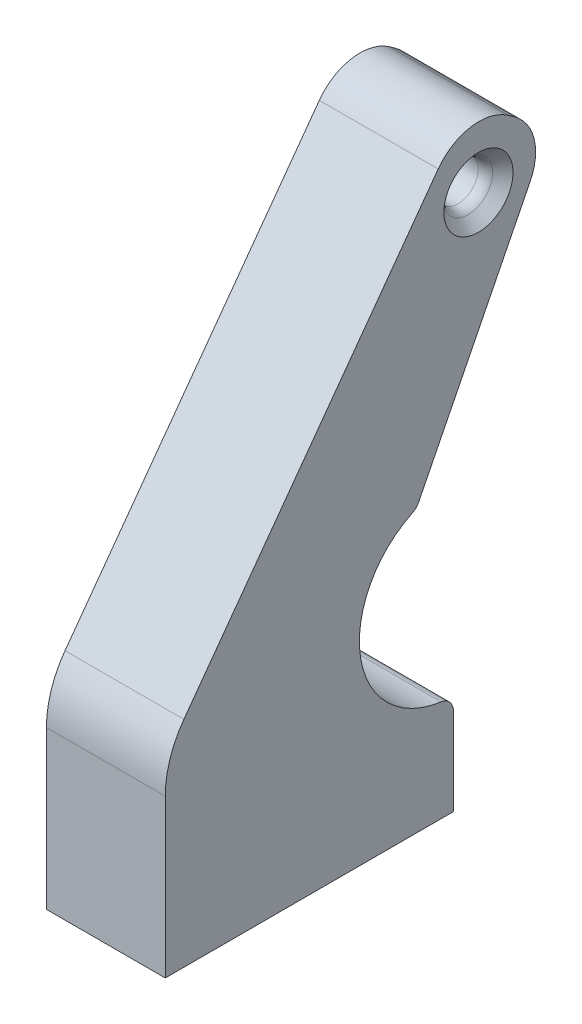
ISO-10303-21;
HEADER;
FILE_DESCRIPTION(('STEP AP214'),'2;1');
FILE_NAME('part.step','',(''),(''),'','','');
FILE_SCHEMA(('AUTOMOTIVE_DESIGN { 1 0 10303 214 1 1 1 1 }'));
ENDSEC;
DATA;
#1=APPLICATION_CONTEXT('core data for automotive mechanical design processes');
#2=APPLICATION_PROTOCOL_DEFINITION('international standard','automotive_design',2000,#1);
#3=PRODUCT_CONTEXT('',#1,'mechanical');
#4=PRODUCT('Part','Part','',(#3));
#5=PRODUCT_RELATED_PRODUCT_CATEGORY('part','',(#4));
#6=PRODUCT_DEFINITION_FORMATION('','',#4);
#7=PRODUCT_DEFINITION_CONTEXT('part definition',#1,'design');
#8=PRODUCT_DEFINITION('design','',#6,#7);
#9=PRODUCT_DEFINITION_SHAPE('','',#8);
#10=(LENGTH_UNIT() NAMED_UNIT(*) SI_UNIT(.MILLI.,.METRE.));
#11=(NAMED_UNIT(*) PLANE_ANGLE_UNIT() SI_UNIT($,.RADIAN.));
#12=(NAMED_UNIT(*) SI_UNIT($,.STERADIAN.) SOLID_ANGLE_UNIT());
#13=UNCERTAINTY_MEASURE_WITH_UNIT(LENGTH_MEASURE(1.E-05),#10,'distance_accuracy_value','');
#14=(GEOMETRIC_REPRESENTATION_CONTEXT(3) GLOBAL_UNCERTAINTY_ASSIGNED_CONTEXT((#13)) GLOBAL_UNIT_ASSIGNED_CONTEXT((#10,
#11,#12)) REPRESENTATION_CONTEXT('',''));
#15=CARTESIAN_POINT('',(0.,0.,0.));
#16=DIRECTION('',(0.,0.,1.));
#17=DIRECTION('',(1.,0.,0.));
#18=AXIS2_PLACEMENT_3D('',#15,#16,#17);
#19=CARTESIAN_POINT('',(-273.827793121338,-35.6710180798713,728.04998779297));
#20=DIRECTION('',(1.,0.,0.));
#21=DIRECTION('',(0.,0.30937778389199,0.950939213006847));
#22=AXIS2_PLACEMENT_3D('',#19,#20,#21);
#23=CYLINDRICAL_SURFACE('',#22,6.7499999999991);
#24=CARTESIAN_POINT('',(-270.75033569336,-35.6710180798713,728.04998779297));
#25=DIRECTION('',(-1.,0.,0.));
#26=DIRECTION('',(0.,0.30937778389199,0.950939213006847));
#27=AXIS2_PLACEMENT_3D('',#24,#25,#26);
#28=CIRCLE('',#27,6.7499999999991);
#29=CARTESIAN_POINT('',(-270.750335693359,-35.6710180798713,734.799987792969));
#30=VERTEX_POINT('',#29);
#31=CARTESIAN_POINT('',(-270.75033569336,-31.6993252843352,733.507840515229));
#32=VERTEX_POINT('',#31);
#33=EDGE_CURVE('E11',#30,#32,#28,.T.);
#34=ORIENTED_EDGE('',*,*,#33,.T.);
#35=DIRECTION('',(-1.,0.,0.));
#36=VECTOR('',#35,1.);
#37=CARTESIAN_POINT('',(-273.827793121338,-31.6993252843352,733.507840515229));
#38=LINE('',#37,#36);
#39=CARTESIAN_POINT('',(-279.00033569336,-31.6993252843351,733.507840515229));
#40=VERTEX_POINT('',#39);
#41=EDGE_CURVE('E31',#32,#40,#38,.T.);
#42=ORIENTED_EDGE('',*,*,#41,.T.);
#43=CARTESIAN_POINT('',(-279.00033569336,-35.6710180798713,728.04998779297));
#44=DIRECTION('',(1.,0.,0.));
#45=DIRECTION('',(0.,0.30937778389199,0.950939213006847));
#46=AXIS2_PLACEMENT_3D('',#43,#44,#45);
#47=CIRCLE('',#46,6.7499999999991);
#48=CARTESIAN_POINT('',(-279.00033569336,-35.6710180798713,734.799987792969));
#49=VERTEX_POINT('',#48);
#50=EDGE_CURVE('E364',#40,#49,#47,.T.);
#51=ORIENTED_EDGE('',*,*,#50,.T.);
#52=DIRECTION('',(1.,0.,0.));
#53=VECTOR('',#52,1.);
#54=CARTESIAN_POINT('',(-273.827793121338,-35.6710180798713,734.799987792969));
#55=LINE('',#54,#53);
#56=EDGE_CURVE('E361',#49,#30,#55,.T.);
#57=ORIENTED_EDGE('',*,*,#56,.T.);
#58=EDGE_LOOP('',(#34,#42,#51,#57));
#59=FACE_BOUND('',#58,.T.);
#60=ADVANCED_FACE('F16',(#59),#23,.T.);
#61=CARTESIAN_POINT('',(-274.37533569336,-46.6000583290239,734.799987792969));
#62=DIRECTION('',(0.,0.,-1.));
#63=DIRECTION('',(-1.,0.,0.));
#64=AXIS2_PLACEMENT_3D('',#61,#62,#63);
#65=PLANE('',#64);
#66=ORIENTED_EDGE('',*,*,#56,.F.);
#67=DIRECTION('',(0.,-1.,0.));
#68=VECTOR('',#67,1.);
#69=CARTESIAN_POINT('',(-279.00033569336,-40.6000632436393,734.799987792969));
#70=LINE('',#69,#68);
#71=CARTESIAN_POINT('',(-279.00033569336,-46.6000583290239,734.799987792969));
#72=VERTEX_POINT('',#71);
#73=EDGE_CURVE('E358',#49,#72,#70,.T.);
#74=ORIENTED_EDGE('',*,*,#73,.T.);
#75=DIRECTION('',(1.,0.,0.));
#76=VECTOR('',#75,1.);
#77=CARTESIAN_POINT('',(-275.56283569336,-46.6000583290239,734.799987792969));
#78=LINE('',#77,#76);
#79=CARTESIAN_POINT('',(-270.75033569336,-46.6000583290239,734.799987792969));
#80=VERTEX_POINT('',#79);
#81=EDGE_CURVE('E355',#72,#80,#78,.T.);
#82=ORIENTED_EDGE('',*,*,#81,.T.);
#83=DIRECTION('',(0.,1.,0.));
#84=VECTOR('',#83,1.);
#85=CARTESIAN_POINT('',(-270.750335693359,-40.6000632436393,734.799987792969));
#86=LINE('',#85,#84);
#87=EDGE_CURVE('E335',#80,#30,#86,.T.);
#88=ORIENTED_EDGE('',*,*,#87,.T.);
#89=EDGE_LOOP('',(#66,#74,#82,#88));
#90=FACE_BOUND('',#89,.T.);
#91=ADVANCED_FACE('F413',(#90),#65,.F.);
#92=CARTESIAN_POINT('',(-279.00033569336,-34.6000681582547,741.799997329712));
#93=DIRECTION('',(-1.,0.,0.));
#94=DIRECTION('',(0.,0.,1.));
#95=AXIS2_PLACEMENT_3D('',#92,#93,#94);
#96=PLANE('',#95);
#97=DIRECTION('',(0.,0.,1.));
#98=VECTOR('',#97,1.);
#99=CARTESIAN_POINT('',(-279.00033569336,-42.8500583290238,730.799997329712));
#100=LINE('',#99,#98);
#101=CARTESIAN_POINT('',(-279.00033569336,-42.8500583290238,716.799997329712));
#102=VERTEX_POINT('',#101);
#103=CARTESIAN_POINT('',(-279.00033569336,-42.8500583290238,722.799997329712));
#104=VERTEX_POINT('',#103);
#105=EDGE_CURVE('E203',#102,#104,#100,.T.);
#106=ORIENTED_EDGE('',*,*,#105,.F.);
#107=DIRECTION('',(0.,-1.,0.));
#108=VECTOR('',#107,1.);
#109=CARTESIAN_POINT('',(-279.00033569336,-40.1625632436392,716.799997329712));
#110=LINE('',#109,#108);
#111=CARTESIAN_POINT('',(-279.00033569336,-40.6000583290238,716.799997329712));
#112=VERTEX_POINT('',#111);
#113=EDGE_CURVE('E207',#112,#102,#110,.T.);
#114=ORIENTED_EDGE('',*,*,#113,.F.);
#115=DIRECTION('',(0.,0.,-1.));
#116=VECTOR('',#115,1.);
#117=CARTESIAN_POINT('',(-279.00033569336,-40.6000583290238,730.799997329712));
#118=LINE('',#117,#116);
#119=CARTESIAN_POINT('',(-279.00033569336,-40.6000583290238,722.799997329712));
#120=VERTEX_POINT('',#119);
#121=EDGE_CURVE('E188',#120,#112,#118,.T.);
#122=ORIENTED_EDGE('',*,*,#121,.F.);
#123=DIRECTION('',(0.,1.,0.));
#124=VECTOR('',#123,1.);
#125=CARTESIAN_POINT('',(-279.00033569336,-40.1625632436393,722.799997329712));
#126=LINE('',#125,#124);
#127=EDGE_CURVE('E187',#104,#120,#126,.T.);
#128=ORIENTED_EDGE('',*,*,#127,.F.);
#129=EDGE_LOOP('',(#106,#114,#122,#128));
#130=FACE_BOUND('',#129,.T.);
#131=DIRECTION('',(0.,0.,1.));
#132=VECTOR('',#131,1.);
#133=CARTESIAN_POINT('',(-279.00033569336,-42.8500583290238,735.799997329712));
#134=LINE('',#133,#132);
#135=CARTESIAN_POINT('',(-279.00033569336,-42.8500583290238,726.799997329712));
#136=VERTEX_POINT('',#135);
#137=CARTESIAN_POINT('',(-279.00033569336,-42.8500583290238,732.799997329712));
#138=VERTEX_POINT('',#137);
#139=EDGE_CURVE('E192',#136,#138,#134,.T.);
#140=ORIENTED_EDGE('',*,*,#139,.F.);
#141=DIRECTION('',(0.,-1.,0.));
#142=VECTOR('',#141,1.);
#143=CARTESIAN_POINT('',(-279.00033569336,-40.1625632436392,726.799997329712));
#144=LINE('',#143,#142);
#145=CARTESIAN_POINT('',(-279.00033569336,-40.6000583290238,726.799997329712));
#146=VERTEX_POINT('',#145);
#147=EDGE_CURVE('E196',#146,#136,#144,.T.);
#148=ORIENTED_EDGE('',*,*,#147,.F.);
#149=DIRECTION('',(0.,0.,-1.));
#150=VECTOR('',#149,1.);
#151=CARTESIAN_POINT('',(-279.00033569336,-40.6000583290238,730.799997329712));
#152=LINE('',#151,#150);
#153=CARTESIAN_POINT('',(-279.00033569336,-40.6000583290238,732.799997329712));
#154=VERTEX_POINT('',#153);
#155=EDGE_CURVE('E183',#154,#146,#152,.T.);
#156=ORIENTED_EDGE('',*,*,#155,.F.);
#157=DIRECTION('',(0.,1.,0.));
#158=VECTOR('',#157,1.);
#159=CARTESIAN_POINT('',(-279.00033569336,-40.1625632436393,732.799997329712));
#160=LINE('',#159,#158);
#161=EDGE_CURVE('E182',#138,#154,#160,.T.);
#162=ORIENTED_EDGE('',*,*,#161,.F.);
#163=EDGE_LOOP('',(#140,#148,#156,#162));
#164=FACE_BOUND('',#163,.T.);
#165=CARTESIAN_POINT('',(-279.00033569336,-10.248377883338,713.066791534424));
#166=DIRECTION('',(-1.,0.,0.));
#167=DIRECTION('',(0.,0.,1.));
#168=AXIS2_PLACEMENT_3D('',#165,#166,#167);
#169=CIRCLE('',#168,1.4);
#170=CARTESIAN_POINT('',(-279.00033569336,-10.248377883338,714.466791534424));
#171=VERTEX_POINT('',#170);
#172=EDGE_CURVE('E284',#171,#171,#169,.T.);
#173=ORIENTED_EDGE('',*,*,#172,.F.);
#174=EDGE_LOOP('',(#173));
#175=FACE_BOUND('',#174,.T.);
#176=ORIENTED_EDGE('',*,*,#50,.F.);
#177=DIRECTION('',(0.,-0.808570773668164,0.5883989326721));
#178=VECTOR('',#177,1.);
#179=CARTESIAN_POINT('',(-279.00033569336,-28.4007128286642,731.107432150961));
#180=LINE('',#179,#178);
#181=CARTESIAN_POINT('',(-279.00033569336,-7.44743679777908,715.859681856172));
#182=VERTEX_POINT('',#181);
#183=EDGE_CURVE('E267',#182,#40,#180,.T.);
#184=ORIENTED_EDGE('',*,*,#183,.F.);
#185=CARTESIAN_POINT('',(-279.00033569336,-9.50683306213146,713.029684148333));
#186=DIRECTION('',(-1.,0.,0.));
#187=DIRECTION('',(0.,0.986699796933502,0.16255310126659));
#188=AXIS2_PLACEMENT_3D('',#185,#186,#187);
#189=CIRCLE('',#188,3.49999999999997);
#190=CARTESIAN_POINT('',(-279.00033569336,-6.64845679766597,711.009861103921));
#191=VERTEX_POINT('',#190);
#192=EDGE_CURVE('E331',#182,#191,#189,.T.);
#193=ORIENTED_EDGE('',*,*,#192,.T.);
#194=DIRECTION('',(0.,0.577092298403606,0.816678932704428));
#195=VECTOR('',#194,1.);
#196=CARTESIAN_POINT('',(-279.00033569336,-4.34518633317845,714.26936130843));
#197=LINE('',#196,#195);
#198=CARTESIAN_POINT('',(-279.00033569336,-6.9534152925166,710.578295514183));
#199=VERTEX_POINT('',#198);
#200=EDGE_CURVE('E262',#199,#191,#197,.T.);
#201=ORIENTED_EDGE('',*,*,#200,.F.);
#202=CARTESIAN_POINT('',(-279.00033569336,-9.81179155698201,712.598118558596));
#203=DIRECTION('',(-1.,0.,0.));
#204=DIRECTION('',(0.,0.242526437814304,-0.970144796904619));
#205=AXIS2_PLACEMENT_3D('',#202,#203,#204);
#206=CIRCLE('',#205,3.49999999999997);
#207=CARTESIAN_POINT('',(-279.00033569336,-11.3834425296636,709.470833278985));
#208=VERTEX_POINT('',#207);
#209=EDGE_CURVE('E325',#199,#208,#206,.T.);
#210=ORIENTED_EDGE('',*,*,#209,.T.);
#211=DIRECTION('',(0.,0.89351007988874,-0.449043135051876));
#212=VECTOR('',#211,1.);
#213=CARTESIAN_POINT('',(-279.00033569336,-33.1299684273091,720.399784597342));
#214=LINE('',#213,#212);
#215=CARTESIAN_POINT('',(-279.00033569336,-26.7832547609087,717.210175138888));
#216=VERTEX_POINT('',#215);
#217=EDGE_CURVE('E256',#216,#208,#214,.T.);
#218=ORIENTED_EDGE('',*,*,#217,.F.);
#219=CARTESIAN_POINT('',(-279.00033569336,-26.3342116258567,718.103685218777));
#220=DIRECTION('',(1.,0.,0.));
#221=DIRECTION('',(0.,-0.711146802373736,-0.703043544507459));
#222=AXIS2_PLACEMENT_3D('',#219,#220,#221);
#223=CIRCLE('',#222,1.);
#224=CARTESIAN_POINT('',(-279.00033569336,-27.2328088672154,717.664910791739));
#225=VERTEX_POINT('',#224);
#226=EDGE_CURVE('E314',#225,#216,#223,.T.);
#227=ORIENTED_EDGE('',*,*,#226,.F.);
#228=CARTESIAN_POINT('',(-279.00033569336,-33.1000681582548,714.799997329712));
#229=DIRECTION('',(1.,0.,0.));
#230=DIRECTION('',(0.,0.,1.));
#231=AXIS2_PLACEMENT_3D('',#228,#229,#230);
#232=CIRCLE('',#231,6.52935377607868);
#233=CARTESIAN_POINT('',(-279.00033569336,-39.5715777867919,715.667190422941));
#234=VERTEX_POINT('',#233);
#235=EDGE_CURVE('E321',#225,#234,#232,.T.);
#236=ORIENTED_EDGE('',*,*,#235,.T.);
#237=CARTESIAN_POINT('',(-279.00033569336,-40.5627186945256,715.800004959107));
#238=DIRECTION('',(1.,0.,0.));
#239=DIRECTION('',(0.,0.658477586495885,-0.752600337551449));
#240=AXIS2_PLACEMENT_3D('',#237,#238,#239);
#241=CIRCLE('',#240,1.);
#242=CARTESIAN_POINT('',(-279.00033569336,-40.5627186945256,714.800004959107));
#243=VERTEX_POINT('',#242);
#244=EDGE_CURVE('E281',#243,#234,#241,.T.);
#245=ORIENTED_EDGE('',*,*,#244,.F.);
#246=DIRECTION('',(0.,-1.,0.));
#247=VECTOR('',#246,1.);
#248=CARTESIAN_POINT('',(-279.00033569336,-34.6000681582546,714.800004959107));
#249=LINE('',#248,#247);
#250=CARTESIAN_POINT('',(-279.00033569336,-46.6000583290238,714.800004959107));
#251=VERTEX_POINT('',#250);
#252=EDGE_CURVE('E318',#243,#251,#249,.T.);
#253=ORIENTED_EDGE('',*,*,#252,.T.);
#254=DIRECTION('',(0.,0.,1.));
#255=VECTOR('',#254,1.);
#256=CARTESIAN_POINT('',(-279.00033569336,-46.6000583290239,741.799997329712));
#257=LINE('',#256,#255);
#258=EDGE_CURVE('E315',#251,#72,#257,.T.);
#259=ORIENTED_EDGE('',*,*,#258,.T.);
#260=ORIENTED_EDGE('',*,*,#73,.F.);
#261=EDGE_LOOP('',(#176,#184,#193,#201,#210,#218,#227,#236,#245,#253,#259,#260));
#262=FACE_BOUND('',#261,.T.);
#263=ADVANCED_FACE('F375',(#130,#164,#175,#262),#96,.T.);
#264=CARTESIAN_POINT('',(-274.499992370605,-26.3342116258567,718.103685218777));
#265=DIRECTION('',(-1.,0.,0.));
#266=DIRECTION('',(0.,-0.711146802373736,-0.703043544507459));
#267=AXIS2_PLACEMENT_3D('',#264,#265,#266);
#268=CYLINDRICAL_SURFACE('',#267,1.);
#269=ORIENTED_EDGE('',*,*,#226,.T.);
#270=DIRECTION('',(1.,0.,0.));
#271=VECTOR('',#270,1.);
#272=CARTESIAN_POINT('',(-274.499992370605,-26.7832547609087,717.210175138888));
#273=LINE('',#272,#271);
#274=CARTESIAN_POINT('',(-270.750335693359,-26.7832547609087,717.210175138888));
#275=VERTEX_POINT('',#274);
#276=EDGE_CURVE('E311',#216,#275,#273,.T.);
#277=ORIENTED_EDGE('',*,*,#276,.T.);
#278=CARTESIAN_POINT('',(-270.75033569336,-26.3342116258568,718.103685218777));
#279=DIRECTION('',(-1.,0.,0.));
#280=DIRECTION('',(0.,-0.711146802373736,-0.703043544507459));
#281=AXIS2_PLACEMENT_3D('',#278,#279,#280);
#282=CIRCLE('',#281,1.);
#283=CARTESIAN_POINT('',(-270.75033569336,-27.2328088672154,717.664910791739));
#284=VERTEX_POINT('',#283);
#285=EDGE_CURVE('E308',#275,#284,#282,.T.);
#286=ORIENTED_EDGE('',*,*,#285,.T.);
#287=DIRECTION('',(-1.,0.,0.));
#288=VECTOR('',#287,1.);
#289=CARTESIAN_POINT('',(-274.499992370605,-27.2328088672154,717.664910791739));
#290=LINE('',#289,#288);
#291=EDGE_CURVE('E300',#284,#225,#290,.T.);
#292=ORIENTED_EDGE('',*,*,#291,.T.);
#293=EDGE_LOOP('',(#269,#277,#286,#292));
#294=FACE_BOUND('',#293,.T.);
#295=ADVANCED_FACE('F393',(#294),#268,.T.);
#296=CARTESIAN_POINT('',(-274.499992370605,-33.1000681582548,714.799997329712));
#297=DIRECTION('',(-1.,0.,0.));
#298=DIRECTION('',(0.,0.,1.));
#299=AXIS2_PLACEMENT_3D('',#296,#297,#298);
#300=CYLINDRICAL_SURFACE('',#299,6.52935377607868);
#301=ORIENTED_EDGE('',*,*,#291,.F.);
#302=CARTESIAN_POINT('',(-270.75033569336,-33.1000681582548,714.799997329712));
#303=DIRECTION('',(-1.,0.,0.));
#304=DIRECTION('',(0.,0.,1.));
#305=AXIS2_PLACEMENT_3D('',#302,#303,#304);
#306=CIRCLE('',#305,6.52935377607868);
#307=CARTESIAN_POINT('',(-270.75033569336,-39.5715777867919,715.667190422941));
#308=VERTEX_POINT('',#307);
#309=EDGE_CURVE('E293',#308,#284,#306,.T.);
#310=ORIENTED_EDGE('',*,*,#309,.F.);
#311=DIRECTION('',(1.,0.,0.));
#312=VECTOR('',#311,1.);
#313=CARTESIAN_POINT('',(-274.499992370605,-39.5715777867919,715.667190422941));
#314=LINE('',#313,#312);
#315=EDGE_CURVE('E171',#234,#308,#314,.T.);
#316=ORIENTED_EDGE('',*,*,#315,.F.);
#317=ORIENTED_EDGE('',*,*,#235,.F.);
#318=EDGE_LOOP('',(#301,#310,#316,#317));
#319=FACE_BOUND('',#318,.T.);
#320=CARTESIAN_POINT('',(-274.916685922484,-33.6000583290237,721.310179398005));
#321=CARTESIAN_POINT('',(-274.898596438544,-33.7294754310834,721.300223867614));
#322=CARTESIAN_POINT('',(-274.874562019229,-33.8574737290883,721.28652789275));
#323=CARTESIAN_POINT('',(-274.818432622359,-34.1104355228666,721.251968288405));
#324=CARTESIAN_POINT('',(-274.786356255468,-34.235405304876,721.231121167638));
#325=CARTESIAN_POINT('',(-274.717658497379,-34.4834142155065,721.182385045218));
#326=CARTESIAN_POINT('',(-274.681012111517,-34.6064381744713,721.154456370184));
#327=CARTESIAN_POINT('',(-274.605961872444,-34.8502498922692,721.091672624799));
#328=CARTESIAN_POINT('',(-274.567556867342,-34.9710361104918,721.056812963234));
#329=CARTESIAN_POINT('',(-274.483791171802,-35.2332447174275,720.972873607317));
#330=CARTESIAN_POINT('',(-274.43849508939,-35.3742283648451,720.922350570176));
#331=CARTESIAN_POINT('',(-274.351116998985,-35.6532662773653,720.811334975725));
#332=CARTESIAN_POINT('',(-274.309035169777,-35.7913203792103,720.750841864441));
#333=CARTESIAN_POINT('',(-274.230754719766,-36.0637788304842,720.619931780602));
#334=CARTESIAN_POINT('',(-274.194536346288,-36.1981941073777,720.549549684936));
#335=CARTESIAN_POINT('',(-274.130475656845,-36.4632138516919,720.398652397549));
#336=CARTESIAN_POINT('',(-274.102627651204,-36.5938208529732,720.31814414203));
#337=CARTESIAN_POINT('',(-274.056249721641,-36.8622905760693,720.139146184345));
#338=CARTESIAN_POINT('',(-274.038820684541,-36.9997061397411,720.039681900149));
#339=CARTESIAN_POINT('',(-274.022378450128,-37.2671526054903,719.829579150938));
#340=CARTESIAN_POINT('',(-274.023361949907,-37.3971848278211,719.718942693569));
#341=CARTESIAN_POINT('',(-274.047475668867,-37.6262346670539,719.508112688586));
#342=CARTESIAN_POINT('',(-274.066906747595,-37.7268198705014,719.409229271173));
#343=CARTESIAN_POINT('',(-274.126558694515,-37.918446161767,719.208490601389));
#344=CARTESIAN_POINT('',(-274.16674117819,-38.0095044990289,719.106641162452));
#345=CARTESIAN_POINT('',(-274.258674833654,-38.1588001736963,718.929373585275));
#346=CARTESIAN_POINT('',(-274.305291829229,-38.2196542056572,718.853510029549));
#347=CARTESIAN_POINT('',(-274.413407744287,-38.3329765228474,718.706114168694));
#348=CARTESIAN_POINT('',(-274.47490247873,-38.3854471594075,718.634580652608));
#349=CARTESIAN_POINT('',(-274.613299632079,-38.4811184718606,718.499146770859));
#350=CARTESIAN_POINT('',(-274.690323748403,-38.5242399651235,718.435313494752));
#351=CARTESIAN_POINT('',(-274.857971877942,-38.5996086245201,718.320263116173));
#352=CARTESIAN_POINT('',(-274.948585789793,-38.6318638103077,718.269036717013));
#353=CARTESIAN_POINT('',(-275.127313053853,-38.6812790726452,718.188870957083));
#354=CARTESIAN_POINT('',(-275.214095170936,-38.6998941525757,718.157849813044));
#355=CARTESIAN_POINT('',(-275.392838494733,-38.7283597608766,718.109919451293));
#356=CARTESIAN_POINT('',(-275.484796944939,-38.7382149080161,718.093002797129));
#357=CARTESIAN_POINT('',(-275.662848831733,-38.7486345733358,718.075092860627));
#358=CARTESIAN_POINT('',(-275.748779969568,-38.7499147934875,718.072873108537));
#359=CARTESIAN_POINT('',(-275.91979695346,-38.7450775423048,718.081209623027));
#360=CARTESIAN_POINT('',(-276.00488299974,-38.7389618675482,718.091762786867));
#361=CARTESIAN_POINT('',(-276.170171654379,-38.7195523062499,718.124784703877));
#362=CARTESIAN_POINT('',(-276.250435742047,-38.7063944120117,718.14702757483));
#363=CARTESIAN_POINT('',(-276.405648693829,-38.6730883521933,718.202193407293));
#364=CARTESIAN_POINT('',(-276.48059742908,-38.6529400172086,718.235116627626));
#365=CARTESIAN_POINT('',(-276.62543398966,-38.6051950000859,718.311136638133));
#366=CARTESIAN_POINT('',(-276.695122336699,-38.577406235112,718.354491587271));
#367=CARTESIAN_POINT('',(-276.825712966423,-38.515026068588,718.448816967474));
#368=CARTESIAN_POINT('',(-276.886613204242,-38.4804330882067,718.499789165365));
#369=CARTESIAN_POINT('',(-277.00352170562,-38.4018573282634,718.611627003385));
#370=CARTESIAN_POINT('',(-277.058717098276,-38.3573366310419,718.672961397927));
#371=CARTESIAN_POINT('',(-277.157830957669,-38.2617543775988,718.799467832837));
#372=CARTESIAN_POINT('',(-277.201743548333,-38.2106894338045,718.864641851244));
#373=CARTESIAN_POINT('',(-277.296088806238,-38.0785894959144,719.026339482918));
#374=CARTESIAN_POINT('',(-277.340566390633,-37.9944070888198,719.123775308087));
#375=CARTESIAN_POINT('',(-277.409569305362,-37.816571222677,719.317121989136));
#376=CARTESIAN_POINT('',(-277.434050556925,-37.722897348968,719.413029021545));
#377=CARTESIAN_POINT('',(-277.461752251025,-37.5560164190855,719.573502875767));
#378=CARTESIAN_POINT('',(-277.469034161687,-37.4845430739517,719.639241248555));
#379=CARTESIAN_POINT('',(-277.476232381096,-37.3385104791356,719.767645949927));
#380=CARTESIAN_POINT('',(-277.476145479757,-37.2639498986937,719.830310927751));
#381=CARTESIAN_POINT('',(-277.466478658022,-37.0363201891255,720.013075317427));
#382=CARTESIAN_POINT('',(-277.447485843722,-36.8793544753249,720.12789478387));
#383=CARTESIAN_POINT('',(-277.397529432425,-36.5913504505306,720.319688800997));
#384=CARTESIAN_POINT('',(-277.369824943249,-36.4616069885109,720.399593023204));
#385=CARTESIAN_POINT('',(-277.306162181129,-36.1983480501877,720.549436175968));
#386=CARTESIAN_POINT('',(-277.270199132614,-36.064830430776,720.619369302592));
#387=CARTESIAN_POINT('',(-277.192539163956,-35.7943692389465,720.749433499948));
#388=CARTESIAN_POINT('',(-277.15082904551,-35.6574183919806,720.809541291049));
#389=CARTESIAN_POINT('',(-277.064211077747,-35.3806246413393,720.91994229139));
#390=CARTESIAN_POINT('',(-277.019303308725,-35.2407818103457,720.970235746954));
#391=CARTESIAN_POINT('',(-276.935691019803,-34.979118012193,721.054404958988));
#392=CARTESIAN_POINT('',(-276.897054325944,-34.8577003338194,721.089609386296));
#393=CARTESIAN_POINT('',(-276.821516483059,-34.612605567646,721.153005010393));
#394=CARTESIAN_POINT('',(-276.784614196985,-34.4889300360431,721.181200855398));
#395=CARTESIAN_POINT('',(-276.715381526856,-34.2394839445746,721.230415688855));
#396=CARTESIAN_POINT('',(-276.683030026097,-34.113726307301,721.251468512288));
#397=CARTESIAN_POINT('',(-276.626429884366,-33.8591493447336,721.286348143858));
#398=CARTESIAN_POINT('',(-276.602200147378,-33.7303236138634,721.300158135359));
#399=CARTESIAN_POINT('',(-276.583989278932,-33.6000583290238,721.310179398005));
#400=B_SPLINE_CURVE_WITH_KNOTS('',3,(#320,#321,#322,#323,#324,#325,#326,#327,#328,#329,#330,
#331,#332,#333,#334,#335,#336,#337,#338,#339,#340,#341,#342,#343,#344,#345,#346,#347,#348,#349,
#350,#351,#352,#353,#354,#355,#356,#357,#358,#359,#360,#361,#362,#363,#364,#365,#366,#367,#368,
#369,#370,#371,#372,#373,#374,#375,#376,#377,#378,#379,#380,#381,#382,#383,#384,#385,#386,#387,
#388,#389,#390,#391,#392,#393,#394,#395,#396,#397,#398,#399),.UNSPECIFIED.,.F.,.F.,(4,2,2,2,2,2,
2,2,2,2,2,2,2,2,2,2,2,2,2,2,2,2,2,2,2,2,2,2,2,2,2,2,2,2,2,2,2,2,2,4),(0.,0.392550406198176,
0.784200625308011,1.17809545343948,1.57225207935849,2.04128646751293,2.51034692569801,
2.97779277459349,3.44492015938974,3.95527909259931,4.46554647661927,4.89120747938449,
5.31608392900281,5.63839654192885,5.96061859500416,6.28547144253412,6.61008401119135,
6.89061798127265,7.17100394889987,7.42766008178672,7.68425388142843,7.93606250173195,
8.18787722472558,8.44671589084939,8.70561468818124,8.9857820651996,9.26609505870124,
9.67252186527204,10.0798421761935,10.3715964831279,10.6634778880245,11.2474529318844,
11.7115085003218,12.175833091009,12.6412423627619,13.1066399519583,13.5030114762187,
13.8991194141191,14.2933239861291,14.6884398274054),.UNSPECIFIED.);
#401=CARTESIAN_POINT('',(-274.916685922484,-33.6000583290238,721.310179398005));
#402=VERTEX_POINT('',#401);
#403=CARTESIAN_POINT('',(-276.583989278932,-33.6000583290238,721.310179398005));
#404=VERTEX_POINT('',#403);
#405=EDGE_CURVE('E20',#402,#404,#400,.T.);
#406=ORIENTED_EDGE('',*,*,#405,.F.);
#407=DIRECTION('',(1.,0.,0.));
#408=VECTOR('',#407,1.);
#409=CARTESIAN_POINT('',(-274.499992370605,-33.6000583290238,721.310179398005));
#410=LINE('',#409,#408);
#411=EDGE_CURVE('E168',#404,#402,#410,.T.);
#412=ORIENTED_EDGE('',*,*,#411,.F.);
#413=EDGE_LOOP('',(#406,#412));
#414=FACE_BOUND('',#413,.T.);
#415=ADVANCED_FACE('F169',(#319,#414),#300,.F.);
#416=CARTESIAN_POINT('',(-270.75033569336,-34.6000681582547,741.799997329712));
#417=DIRECTION('',(1.,0.,0.));
#418=DIRECTION('',(0.,0.,-1.));
#419=AXIS2_PLACEMENT_3D('',#416,#417,#418);
#420=PLANE('',#419);
#421=ORIENTED_EDGE('',*,*,#33,.F.);
#422=ORIENTED_EDGE('',*,*,#87,.F.);
#423=DIRECTION('',(0.,0.,1.));
#424=VECTOR('',#423,1.);
#425=CARTESIAN_POINT('',(-270.75033569336,-46.6000583290239,741.799997329712));
#426=LINE('',#425,#424);
#427=CARTESIAN_POINT('',(-270.75033569336,-46.6000583290238,714.800004959107));
#428=VERTEX_POINT('',#427);
#429=EDGE_CURVE('E166',#428,#80,#426,.T.);
#430=ORIENTED_EDGE('',*,*,#429,.F.);
#431=DIRECTION('',(0.,1.,0.));
#432=VECTOR('',#431,1.);
#433=CARTESIAN_POINT('',(-270.75033569336,-34.6000681582546,714.800004959107));
#434=LINE('',#433,#432);
#435=CARTESIAN_POINT('',(-270.75033569336,-40.5627186945256,714.800004959107));
#436=VERTEX_POINT('',#435);
#437=EDGE_CURVE('E297',#428,#436,#434,.T.);
#438=ORIENTED_EDGE('',*,*,#437,.T.);
#439=CARTESIAN_POINT('',(-270.75033569336,-40.5627186945256,715.800004959107));
#440=DIRECTION('',(-1.,0.,0.));
#441=DIRECTION('',(0.,0.658477586495885,-0.752600337551449));
#442=AXIS2_PLACEMENT_3D('',#439,#440,#441);
#443=CIRCLE('',#442,1.);
#444=EDGE_CURVE('E280',#308,#436,#443,.T.);
#445=ORIENTED_EDGE('',*,*,#444,.F.);
#446=ORIENTED_EDGE('',*,*,#309,.T.);
#447=ORIENTED_EDGE('',*,*,#285,.F.);
#448=DIRECTION('',(0.,-0.89351007988874,0.449043135051876));
#449=VECTOR('',#448,1.);
#450=CARTESIAN_POINT('',(-270.750335693359,-33.1299684273091,720.399784597342));
#451=LINE('',#450,#449);
#452=CARTESIAN_POINT('',(-270.75033569336,-11.3834425296635,709.470833278985));
#453=VERTEX_POINT('',#452);
#454=EDGE_CURVE('E257',#453,#275,#451,.T.);
#455=ORIENTED_EDGE('',*,*,#454,.F.);
#456=CARTESIAN_POINT('',(-270.75033569336,-9.811791556982,712.598118558596));
#457=DIRECTION('',(1.,0.,0.));
#458=DIRECTION('',(0.,0.242526437814304,-0.970144796904619));
#459=AXIS2_PLACEMENT_3D('',#456,#457,#458);
#460=CIRCLE('',#459,3.49999999999997);
#461=CARTESIAN_POINT('',(-270.75033569336,-6.95341529251655,710.578295514183));
#462=VERTEX_POINT('',#461);
#463=EDGE_CURVE('E289',#453,#462,#460,.T.);
#464=ORIENTED_EDGE('',*,*,#463,.T.);
#465=DIRECTION('',(0.,-0.577092298403606,-0.816678932704428));
#466=VECTOR('',#465,1.);
#467=CARTESIAN_POINT('',(-270.75033569336,-4.34518633317845,714.26936130843));
#468=LINE('',#467,#466);
#469=CARTESIAN_POINT('',(-270.75033569336,-6.64845679766596,711.009861103921));
#470=VERTEX_POINT('',#469);
#471=EDGE_CURVE('E261',#470,#462,#468,.T.);
#472=ORIENTED_EDGE('',*,*,#471,.F.);
#473=CARTESIAN_POINT('',(-270.75033569336,-9.50683306213145,713.029684148333));
#474=DIRECTION('',(1.,0.,0.));
#475=DIRECTION('',(0.,0.986699796933502,0.16255310126659));
#476=AXIS2_PLACEMENT_3D('',#473,#474,#475);
#477=CIRCLE('',#476,3.49999999999997);
#478=CARTESIAN_POINT('',(-270.75033569336,-7.44743679777915,715.859681856172));
#479=VERTEX_POINT('',#478);
#480=EDGE_CURVE('E286',#470,#479,#477,.T.);
#481=ORIENTED_EDGE('',*,*,#480,.T.);
#482=DIRECTION('',(0.,0.808570773668165,-0.588398932672099));
#483=VECTOR('',#482,1.);
#484=CARTESIAN_POINT('',(-270.75033569336,-28.4007128286642,731.107432150961));
#485=LINE('',#484,#483);
#486=EDGE_CURVE('E266',#32,#479,#485,.T.);
#487=ORIENTED_EDGE('',*,*,#486,.F.);
#488=EDGE_LOOP('',(#421,#422,#430,#438,#445,#446,#447,#455,#464,#472,#481,#487));
#489=FACE_BOUND('',#488,.T.);
#490=CARTESIAN_POINT('',(-270.75033569336,-10.248377883338,713.066791534424));
#491=DIRECTION('',(1.,0.,0.));
#492=DIRECTION('',(0.,0.,1.));
#493=AXIS2_PLACEMENT_3D('',#490,#491,#492);
#494=CIRCLE('',#493,2.39999999999994);
#495=CARTESIAN_POINT('',(-270.75033569336,-10.248377883338,715.466791534424));
#496=VERTEX_POINT('',#495);
#497=EDGE_CURVE('E272',#496,#496,#494,.T.);
#498=ORIENTED_EDGE('',*,*,#497,.F.);
#499=EDGE_LOOP('',(#498));
#500=FACE_BOUND('',#499,.T.);
#501=ADVANCED_FACE('F407',(#489,#500),#420,.T.);
#502=CARTESIAN_POINT('',(-274.499992370605,-40.5627186945256,715.800004959107));
#503=DIRECTION('',(1.,0.,0.));
#504=DIRECTION('',(0.,0.658477586495885,-0.752600337551449));
#505=AXIS2_PLACEMENT_3D('',#502,#503,#504);
#506=CYLINDRICAL_SURFACE('',#505,1.);
#507=ORIENTED_EDGE('',*,*,#444,.T.);
#508=DIRECTION('',(-1.,0.,0.));
#509=VECTOR('',#508,1.);
#510=CARTESIAN_POINT('',(-274.499992370605,-40.5627186945256,714.800004959107));
#511=LINE('',#510,#509);
#512=EDGE_CURVE('E277',#436,#243,#511,.T.);
#513=ORIENTED_EDGE('',*,*,#512,.T.);
#514=ORIENTED_EDGE('',*,*,#244,.T.);
#515=ORIENTED_EDGE('',*,*,#315,.T.);
#516=EDGE_LOOP('',(#507,#513,#514,#515));
#517=FACE_BOUND('',#516,.T.);
#518=ADVANCED_FACE('F405',(#517),#506,.T.);
#519=CARTESIAN_POINT('',(-276.75033569336,-34.6000681582546,714.800004959107));
#520=DIRECTION('',(0.,0.,1.));
#521=DIRECTION('',(1.,0.,0.));
#522=AXIS2_PLACEMENT_3D('',#519,#520,#521);
#523=PLANE('',#522);
#524=ORIENTED_EDGE('',*,*,#512,.F.);
#525=ORIENTED_EDGE('',*,*,#437,.F.);
#526=DIRECTION('',(1.,0.,0.));
#527=VECTOR('',#526,1.);
#528=CARTESIAN_POINT('',(-276.75033569336,-46.6000583290238,714.800004959107));
#529=LINE('',#528,#527);
#530=EDGE_CURVE('E274',#251,#428,#529,.T.);
#531=ORIENTED_EDGE('',*,*,#530,.F.);
#532=ORIENTED_EDGE('',*,*,#252,.F.);
#533=EDGE_LOOP('',(#524,#525,#531,#532));
#534=FACE_BOUND('',#533,.T.);
#535=ADVANCED_FACE('F403',(#534),#523,.F.);
#536=CARTESIAN_POINT('',(-275.750337600708,-33.6000583290238,719.799997329712));
#537=DIRECTION('',(0.,-1.,0.));
#538=DIRECTION('',(0.,0.,1.));
#539=AXIS2_PLACEMENT_3D('',#536,#537,#538);
#540=PLANE('',#539);
#541=ORIENTED_EDGE('',*,*,#411,.T.);
#542=CARTESIAN_POINT('',(-275.750337600708,-33.6000583290238,719.799997329712));
#543=DIRECTION('',(0.,-1.,0.));
#544=DIRECTION('',(0.,0.,1.));
#545=AXIS2_PLACEMENT_3D('',#542,#543,#544);
#546=CIRCLE('',#545,1.725);
#547=EDGE_CURVE('E165',#402,#404,#546,.T.);
#548=ORIENTED_EDGE('',*,*,#547,.T.);
#549=EDGE_LOOP('',(#541,#548));
#550=FACE_BOUND('',#549,.T.);
#551=ADVANCED_FACE('F173',(#550),#540,.T.);
#552=CARTESIAN_POINT('',(-272.164549255733,-10.248377883338,713.066791534424));
#553=DIRECTION('',(-1.,0.,0.));
#554=DIRECTION('',(0.,0.,1.));
#555=AXIS2_PLACEMENT_3D('',#552,#553,#554);
#556=TOROIDAL_SURFACE('',#555,2.4,1.);
#557=CARTESIAN_POINT('',(-272.164549255733,-10.248377883338,713.066791534424));
#558=DIRECTION('',(-1.,0.,0.));
#559=DIRECTION('',(0.,0.,1.));
#560=AXIS2_PLACEMENT_3D('',#557,#558,#559);
#561=CIRCLE('',#560,1.4);
#562=CARTESIAN_POINT('',(-272.164549255733,-10.248377883338,714.466791534424));
#563=VERTEX_POINT('',#562);
#564=EDGE_CURVE('E174',#563,#563,#561,.T.);
#565=ORIENTED_EDGE('',*,*,#564,.T.);
#566=EDGE_LOOP('',(#565));
#567=FACE_BOUND('',#566,.T.);
#568=CARTESIAN_POINT('',(-271.457442474546,-10.248377883338,713.066791534424));
#569=DIRECTION('',(1.,0.,0.));
#570=DIRECTION('',(0.,0.,1.));
#571=AXIS2_PLACEMENT_3D('',#568,#569,#570);
#572=CIRCLE('',#571,1.69289321881337);
#573=CARTESIAN_POINT('',(-271.457442474546,-10.248377883338,714.759684753237));
#574=VERTEX_POINT('',#573);
#575=EDGE_CURVE('E176',#574,#574,#572,.T.);
#576=ORIENTED_EDGE('',*,*,#575,.T.);
#577=EDGE_LOOP('',(#576));
#578=FACE_BOUND('',#577,.T.);
#579=ADVANCED_FACE('F437',(#567,#578),#556,.T.);
#580=CARTESIAN_POINT('',(-271.25033569336,-10.248377883338,713.066791534424));
#581=DIRECTION('',(1.,0.,0.));
#582=DIRECTION('',(0.,0.,1.));
#583=AXIS2_PLACEMENT_3D('',#580,#581,#582);
#584=CONICAL_SURFACE('',#583,1.89999999999997,0.785398163397413);
#585=ORIENTED_EDGE('',*,*,#497,.T.);
#586=EDGE_LOOP('',(#585));
#587=FACE_BOUND('',#586,.T.);
#588=ORIENTED_EDGE('',*,*,#575,.F.);
#589=EDGE_LOOP('',(#588));
#590=FACE_BOUND('',#589,.T.);
#591=ADVANCED_FACE('F440',(#587,#590),#584,.F.);
#592=CARTESIAN_POINT('',(-275.750591278076,-10.248377883338,713.066791534424));
#593=DIRECTION('',(-1.,0.,0.));
#594=DIRECTION('',(0.,0.,1.));
#595=AXIS2_PLACEMENT_3D('',#592,#593,#594);
#596=CYLINDRICAL_SURFACE('',#595,1.4);
#597=ORIENTED_EDGE('',*,*,#172,.T.);
#598=EDGE_LOOP('',(#597));
#599=FACE_BOUND('',#598,.T.);
#600=ORIENTED_EDGE('',*,*,#564,.F.);
#601=EDGE_LOOP('',(#600));
#602=FACE_BOUND('',#601,.T.);
#603=ADVANCED_FACE('F444',(#599,#602),#596,.F.);
#604=CARTESIAN_POINT('',(-273.82779265231,-9.50683306213145,713.029684148333));
#605=DIRECTION('',(-1.,0.,0.));
#606=DIRECTION('',(0.,0.986699796933502,0.16255310126659));
#607=AXIS2_PLACEMENT_3D('',#604,#605,#606);
#608=CYLINDRICAL_SURFACE('',#607,3.49999999999997);
#609=ORIENTED_EDGE('',*,*,#480,.F.);
#610=DIRECTION('',(1.,0.,0.));
#611=VECTOR('',#610,1.);
#612=CARTESIAN_POINT('',(-273.82779265231,-6.64845679766596,711.009861103921));
#613=LINE('',#612,#611);
#614=EDGE_CURVE('E268',#191,#470,#613,.T.);
#615=ORIENTED_EDGE('',*,*,#614,.F.);
#616=ORIENTED_EDGE('',*,*,#192,.F.);
#617=DIRECTION('',(-1.,0.,0.));
#618=VECTOR('',#617,1.);
#619=CARTESIAN_POINT('',(-273.82779265231,-7.44743679777915,715.859681856172));
#620=LINE('',#619,#618);
#621=EDGE_CURVE('E263',#479,#182,#620,.T.);
#622=ORIENTED_EDGE('',*,*,#621,.F.);
#623=EDGE_LOOP('',(#609,#615,#616,#622));
#624=FACE_BOUND('',#623,.T.);
#625=ADVANCED_FACE('F379',(#624),#608,.T.);
#626=CARTESIAN_POINT('',(-273.280250549316,-19.2605386686669,724.456105024974));
#627=DIRECTION('',(0.,-0.5883989326721,-0.808570773668164));
#628=DIRECTION('',(-1.,0.,0.));
#629=AXIS2_PLACEMENT_3D('',#626,#627,#628);
#630=PLANE('',#629);
#631=ORIENTED_EDGE('',*,*,#41,.F.);
#632=ORIENTED_EDGE('',*,*,#486,.T.);
#633=ORIENTED_EDGE('',*,*,#621,.T.);
#634=ORIENTED_EDGE('',*,*,#183,.T.);
#635=EDGE_LOOP('',(#631,#632,#633,#634));
#636=FACE_BOUND('',#635,.T.);
#637=ADVANCED_FACE('F371',(#636),#630,.F.);
#638=CARTESIAN_POINT('',(-274.375334755303,-7.2444005995769,710.166504244987));
#639=DIRECTION('',(0.,-0.816678932704428,0.577092298403606));
#640=DIRECTION('',(-1.,0.,0.));
#641=AXIS2_PLACEMENT_3D('',#638,#639,#640);
#642=PLANE('',#641);
#643=ORIENTED_EDGE('',*,*,#614,.T.);
#644=ORIENTED_EDGE('',*,*,#471,.T.);
#645=DIRECTION('',(-1.,0.,0.));
#646=VECTOR('',#645,1.);
#647=CARTESIAN_POINT('',(-273.856164463223,-6.95341529251656,710.578295514183));
#648=LINE('',#647,#646);
#649=EDGE_CURVE('E258',#462,#199,#648,.T.);
#650=ORIENTED_EDGE('',*,*,#649,.T.);
#651=ORIENTED_EDGE('',*,*,#200,.T.);
#652=EDGE_LOOP('',(#643,#644,#650,#651));
#653=FACE_BOUND('',#652,.T.);
#654=ADVANCED_FACE('F381',(#653),#642,.F.);
#655=CARTESIAN_POINT('',(-273.856164463223,-9.811791556982,712.598118558596));
#656=DIRECTION('',(1.,0.,0.));
#657=DIRECTION('',(0.,0.242526437814304,-0.970144796904619));
#658=AXIS2_PLACEMENT_3D('',#655,#656,#657);
#659=CYLINDRICAL_SURFACE('',#658,3.49999999999997);
#660=ORIENTED_EDGE('',*,*,#209,.F.);
#661=ORIENTED_EDGE('',*,*,#649,.F.);
#662=ORIENTED_EDGE('',*,*,#463,.F.);
#663=DIRECTION('',(1.,0.,0.));
#664=VECTOR('',#663,1.);
#665=CARTESIAN_POINT('',(-273.856164463223,-11.3834425296636,709.470833278985));
#666=LINE('',#665,#664);
#667=EDGE_CURVE('E253',#208,#453,#666,.T.);
#668=ORIENTED_EDGE('',*,*,#667,.F.);
#669=EDGE_LOOP('',(#660,#661,#662,#668));
#670=FACE_BOUND('',#669,.T.);
#671=ADVANCED_FACE('F386',(#670),#659,.T.);
#672=CARTESIAN_POINT('',(-273.336994171143,-23.3700081222867,715.494811198615));
#673=DIRECTION('',(0.,0.449043135051876,0.89351007988874));
#674=DIRECTION('',(-1.,0.,0.));
#675=AXIS2_PLACEMENT_3D('',#672,#673,#674);
#676=PLANE('',#675);
#677=ORIENTED_EDGE('',*,*,#276,.F.);
#678=ORIENTED_EDGE('',*,*,#217,.T.);
#679=ORIENTED_EDGE('',*,*,#667,.T.);
#680=ORIENTED_EDGE('',*,*,#454,.T.);
#681=EDGE_LOOP('',(#677,#678,#679,#680));
#682=FACE_BOUND('',#681,.T.);
#683=ADVANCED_FACE('F390',(#682),#676,.F.);
#684=CARTESIAN_POINT('',(-276.75033569336,-46.6000583290239,741.799997329712));
#685=DIRECTION('',(0.,-1.,0.));
#686=DIRECTION('',(0.,0.,-1.));
#687=AXIS2_PLACEMENT_3D('',#684,#685,#686);
#688=PLANE('',#687);
#689=ORIENTED_EDGE('',*,*,#81,.F.);
#690=ORIENTED_EDGE('',*,*,#258,.F.);
#691=ORIENTED_EDGE('',*,*,#530,.T.);
#692=ORIENTED_EDGE('',*,*,#429,.T.);
#693=EDGE_LOOP('',(#689,#690,#691,#692));
#694=FACE_BOUND('',#693,.T.);
#695=CARTESIAN_POINT('',(-275.750337600708,-46.6000583290238,729.799997329712));
#696=DIRECTION('',(0.,-1.,0.));
#697=DIRECTION('',(0.,0.,1.));
#698=AXIS2_PLACEMENT_3D('',#695,#696,#697);
#699=CIRCLE('',#698,1.725);
#700=CARTESIAN_POINT('',(-275.750337600708,-46.6000583290238,731.524997329712));
#701=VERTEX_POINT('',#700);
#702=EDGE_CURVE('E238',#701,#701,#699,.T.);
#703=ORIENTED_EDGE('',*,*,#702,.F.);
#704=EDGE_LOOP('',(#703));
#705=FACE_BOUND('',#704,.T.);
#706=CARTESIAN_POINT('',(-275.750337600708,-46.6000583290238,719.799997329712));
#707=DIRECTION('',(0.,-1.,0.));
#708=DIRECTION('',(0.,0.,1.));
#709=AXIS2_PLACEMENT_3D('',#706,#707,#708);
#710=CIRCLE('',#709,1.725);
#711=CARTESIAN_POINT('',(-275.750337600708,-46.6000583290238,721.524997329712));
#712=VERTEX_POINT('',#711);
#713=EDGE_CURVE('E241',#712,#712,#710,.T.);
#714=ORIENTED_EDGE('',*,*,#713,.F.);
#715=EDGE_LOOP('',(#714));
#716=FACE_BOUND('',#715,.T.);
#717=ADVANCED_FACE('F410',(#694,#705,#716),#688,.T.);
#718=CARTESIAN_POINT('',(-275.750337600708,-49.6000583290238,719.799997329712));
#719=DIRECTION('',(0.,-1.,0.));
#720=DIRECTION('',(0.,0.,1.));
#721=AXIS2_PLACEMENT_3D('',#718,#719,#720);
#722=CYLINDRICAL_SURFACE('',#721,1.725);
#723=ORIENTED_EDGE('',*,*,#405,.T.);
#724=ORIENTED_EDGE('',*,*,#547,.F.);
#725=EDGE_LOOP('',(#723,#724));
#726=FACE_BOUND('',#725,.T.);
#727=CARTESIAN_POINT('',(-275.750337600708,-40.6000583290238,719.799997329712));
#728=DIRECTION('',(0.,-1.,0.));
#729=DIRECTION('',(0.,0.,1.));
#730=AXIS2_PLACEMENT_3D('',#727,#728,#729);
#731=CIRCLE('',#730,1.725);
#732=CARTESIAN_POINT('',(-275.750337600708,-40.6000583290238,721.524997329712));
#733=VERTEX_POINT('',#732);
#734=EDGE_CURVE('E167',#733,#733,#731,.T.);
#735=ORIENTED_EDGE('',*,*,#734,.T.);
#736=EDGE_LOOP('',(#735));
#737=FACE_BOUND('',#736,.T.);
#738=ADVANCED_FACE('F162',(#726,#737),#722,.F.);
#739=CARTESIAN_POINT('',(-275.750337600708,-49.6000583290238,719.799997329712));
#740=DIRECTION('',(0.,-1.,0.));
#741=DIRECTION('',(0.,0.,1.));
#742=AXIS2_PLACEMENT_3D('',#739,#740,#741);
#743=CYLINDRICAL_SURFACE('',#742,1.725);
#744=CARTESIAN_POINT('',(-275.750337600708,-42.8500583290238,719.799997329712));
#745=DIRECTION('',(0.,1.,0.));
#746=DIRECTION('',(0.,0.,1.));
#747=AXIS2_PLACEMENT_3D('',#744,#745,#746);
#748=CIRCLE('',#747,1.725);
#749=CARTESIAN_POINT('',(-275.750337600708,-42.8500583290238,721.524997329712));
#750=VERTEX_POINT('',#749);
#751=EDGE_CURVE('E244',#750,#750,#748,.T.);
#752=ORIENTED_EDGE('',*,*,#751,.T.);
#753=EDGE_LOOP('',(#752));
#754=FACE_BOUND('',#753,.T.);
#755=ORIENTED_EDGE('',*,*,#713,.T.);
#756=EDGE_LOOP('',(#755));
#757=FACE_BOUND('',#756,.T.);
#758=ADVANCED_FACE('F463',(#754,#757),#743,.F.);
#759=CARTESIAN_POINT('',(-275.750337600708,-44.6000583290238,729.799997329712));
#760=DIRECTION('',(0.,-1.,0.));
#761=DIRECTION('',(0.,0.,1.));
#762=AXIS2_PLACEMENT_3D('',#759,#760,#761);
#763=CYLINDRICAL_SURFACE('',#762,1.725);
#764=CARTESIAN_POINT('',(-275.750337600708,-34.6000583290238,729.799997329712));
#765=DIRECTION('',(0.,-1.,0.));
#766=DIRECTION('',(0.,0.,1.));
#767=AXIS2_PLACEMENT_3D('',#764,#765,#766);
#768=CIRCLE('',#767,1.725);
#769=CARTESIAN_POINT('',(-275.750337600708,-34.6000583290238,731.524997329712));
#770=VERTEX_POINT('',#769);
#771=EDGE_CURVE('E233',#770,#770,#768,.T.);
#772=ORIENTED_EDGE('',*,*,#771,.F.);
#773=EDGE_LOOP('',(#772));
#774=FACE_BOUND('',#773,.T.);
#775=CARTESIAN_POINT('',(-275.750337600708,-40.6000583290238,729.799997329712));
#776=DIRECTION('',(0.,-1.,0.));
#777=DIRECTION('',(0.,0.,1.));
#778=AXIS2_PLACEMENT_3D('',#775,#776,#777);
#779=CIRCLE('',#778,1.725);
#780=CARTESIAN_POINT('',(-275.750337600708,-40.6000583290238,731.524997329712));
#781=VERTEX_POINT('',#780);
#782=EDGE_CURVE('E237',#781,#781,#779,.T.);
#783=ORIENTED_EDGE('',*,*,#782,.T.);
#784=EDGE_LOOP('',(#783));
#785=FACE_BOUND('',#784,.T.);
#786=ADVANCED_FACE('F466',(#774,#785),#763,.F.);
#787=CARTESIAN_POINT('',(-275.750337600708,-44.6000583290238,729.799997329712));
#788=DIRECTION('',(0.,-1.,0.));
#789=DIRECTION('',(0.,0.,1.));
#790=AXIS2_PLACEMENT_3D('',#787,#788,#789);
#791=CYLINDRICAL_SURFACE('',#790,1.725);
#792=CARTESIAN_POINT('',(-275.750337600708,-42.8500583290238,729.799997329712));
#793=DIRECTION('',(0.,1.,0.));
#794=DIRECTION('',(0.,0.,1.));
#795=AXIS2_PLACEMENT_3D('',#792,#793,#794);
#796=CIRCLE('',#795,1.725);
#797=CARTESIAN_POINT('',(-275.750337600708,-42.8500583290238,731.524997329712));
#798=VERTEX_POINT('',#797);
#799=EDGE_CURVE('E234',#798,#798,#796,.T.);
#800=ORIENTED_EDGE('',*,*,#799,.T.);
#801=EDGE_LOOP('',(#800));
#802=FACE_BOUND('',#801,.T.);
#803=ORIENTED_EDGE('',*,*,#702,.T.);
#804=EDGE_LOOP('',(#803));
#805=FACE_BOUND('',#804,.T.);
#806=ADVANCED_FACE('F470',(#802,#805),#791,.F.);
#807=CARTESIAN_POINT('',(-275.750337600708,-34.6000583290238,729.799997329712));
#808=DIRECTION('',(0.,-1.,0.));
#809=DIRECTION('',(0.,0.,1.));
#810=AXIS2_PLACEMENT_3D('',#807,#808,#809);
#811=PLANE('',#810);
#812=ORIENTED_EDGE('',*,*,#771,.T.);
#813=EDGE_LOOP('',(#812));
#814=FACE_BOUND('',#813,.T.);
#815=ADVANCED_FACE('F474',(#814),#811,.T.);
#816=CARTESIAN_POINT('',(-272.750339508057,-47.4043226242065,725.009811401367));
#817=DIRECTION('',(-1.,0.,0.));
#818=DIRECTION('',(0.,0.,1.));
#819=AXIS2_PLACEMENT_3D('',#816,#817,#818);
#820=PLANE('',#819);
#821=DIRECTION('',(0.,1.,0.));
#822=VECTOR('',#821,1.);
#823=CARTESIAN_POINT('',(-272.750339508057,-46.5646904766152,732.799997329712));
#824=LINE('',#823,#822);
#825=CARTESIAN_POINT('',(-272.750339508057,-42.8500583290238,732.799997329712));
#826=VERTEX_POINT('',#825);
#827=CARTESIAN_POINT('',(-272.750339508057,-40.6000583290238,732.799997329712));
#828=VERTEX_POINT('',#827);
#829=EDGE_CURVE('E230',#826,#828,#824,.T.);
#830=ORIENTED_EDGE('',*,*,#829,.T.);
#831=DIRECTION('',(0.,0.,-1.));
#832=VECTOR('',#831,1.);
#833=CARTESIAN_POINT('',(-272.750339508057,-40.6000583290238,722.40490436554));
#834=LINE('',#833,#832);
#835=CARTESIAN_POINT('',(-272.750339508057,-40.6000583290238,726.799997329712));
#836=VERTEX_POINT('',#835);
#837=EDGE_CURVE('E227',#828,#836,#834,.T.);
#838=ORIENTED_EDGE('',*,*,#837,.T.);
#839=DIRECTION('',(0.,-1.,0.));
#840=VECTOR('',#839,1.);
#841=CARTESIAN_POINT('',(-272.750339508057,-46.5646904766152,726.799997329712));
#842=LINE('',#841,#840);
#843=CARTESIAN_POINT('',(-272.750339508057,-42.8500583290238,726.799997329712));
#844=VERTEX_POINT('',#843);
#845=EDGE_CURVE('E224',#836,#844,#842,.T.);
#846=ORIENTED_EDGE('',*,*,#845,.T.);
#847=DIRECTION('',(0.,0.,1.));
#848=VECTOR('',#847,1.);
#849=CARTESIAN_POINT('',(-272.750339508057,-42.8500583290238,727.404904365539));
#850=LINE('',#849,#848);
#851=EDGE_CURVE('E222',#844,#826,#850,.T.);
#852=ORIENTED_EDGE('',*,*,#851,.T.);
#853=EDGE_LOOP('',(#830,#838,#846,#852));
#854=FACE_BOUND('',#853,.T.);
#855=ADVANCED_FACE('F478',(#854),#820,.T.);
#856=CARTESIAN_POINT('',(-272.750339508057,-47.4043226242065,725.009811401367));
#857=DIRECTION('',(-1.,0.,0.));
#858=DIRECTION('',(0.,0.,1.));
#859=AXIS2_PLACEMENT_3D('',#856,#857,#858);
#860=PLANE('',#859);
#861=DIRECTION('',(0.,1.,0.));
#862=VECTOR('',#861,1.);
#863=CARTESIAN_POINT('',(-272.750339508057,-46.5646904766152,722.799997329712));
#864=LINE('',#863,#862);
#865=CARTESIAN_POINT('',(-272.750339508057,-42.8500583290238,722.799997329712));
#866=VERTEX_POINT('',#865);
#867=CARTESIAN_POINT('',(-272.750339508057,-40.6000583290238,722.799997329712));
#868=VERTEX_POINT('',#867);
#869=EDGE_CURVE('E219',#866,#868,#864,.T.);
#870=ORIENTED_EDGE('',*,*,#869,.T.);
#871=DIRECTION('',(0.,0.,-1.));
#872=VECTOR('',#871,1.);
#873=CARTESIAN_POINT('',(-272.750339508057,-40.6000583290238,722.40490436554));
#874=LINE('',#873,#872);
#875=CARTESIAN_POINT('',(-272.750339508057,-40.6000583290238,716.799997329712));
#876=VERTEX_POINT('',#875);
#877=EDGE_CURVE('E216',#868,#876,#874,.T.);
#878=ORIENTED_EDGE('',*,*,#877,.T.);
#879=DIRECTION('',(0.,-1.,0.));
#880=VECTOR('',#879,1.);
#881=CARTESIAN_POINT('',(-272.750339508057,-46.5646904766152,716.799997329712));
#882=LINE('',#881,#880);
#883=CARTESIAN_POINT('',(-272.750339508057,-42.8500583290238,716.799997329712));
#884=VERTEX_POINT('',#883);
#885=EDGE_CURVE('E213',#876,#884,#882,.T.);
#886=ORIENTED_EDGE('',*,*,#885,.T.);
#887=DIRECTION('',(0.,0.,1.));
#888=VECTOR('',#887,1.);
#889=CARTESIAN_POINT('',(-272.750339508057,-42.8500583290238,722.404904365539));
#890=LINE('',#889,#888);
#891=EDGE_CURVE('E211',#884,#866,#890,.T.);
#892=ORIENTED_EDGE('',*,*,#891,.T.);
#893=EDGE_LOOP('',(#870,#878,#886,#892));
#894=FACE_BOUND('',#893,.T.);
#895=ADVANCED_FACE('F482',(#894),#860,.T.);
#896=CARTESIAN_POINT('',(-276.750335693359,-45.7250583290238,716.799997329712));
#897=DIRECTION('',(0.,0.,-1.));
#898=DIRECTION('',(0.,-1.,0.));
#899=AXIS2_PLACEMENT_3D('',#896,#897,#898);
#900=PLANE('',#899);
#901=ORIENTED_EDGE('',*,*,#885,.F.);
#902=DIRECTION('',(1.,0.,0.));
#903=VECTOR('',#902,1.);
#904=CARTESIAN_POINT('',(-276.750335693359,-40.6000583290238,716.799997329712));
#905=LINE('',#904,#903);
#906=EDGE_CURVE('E208',#112,#876,#905,.T.);
#907=ORIENTED_EDGE('',*,*,#906,.F.);
#908=ORIENTED_EDGE('',*,*,#113,.T.);
#909=DIRECTION('',(-1.,0.,0.));
#910=VECTOR('',#909,1.);
#911=CARTESIAN_POINT('',(-276.750335693359,-42.8500583290238,716.799997329712));
#912=LINE('',#911,#910);
#913=EDGE_CURVE('E204',#884,#102,#912,.T.);
#914=ORIENTED_EDGE('',*,*,#913,.F.);
#915=EDGE_LOOP('',(#901,#907,#908,#914));
#916=FACE_BOUND('',#915,.T.);
#917=ADVANCED_FACE('F486',(#916),#900,.F.);
#918=CARTESIAN_POINT('',(-276.750335693359,-42.8500583290238,719.799997329712));
#919=DIRECTION('',(0.,-1.,0.));
#920=DIRECTION('',(0.,0.,1.));
#921=AXIS2_PLACEMENT_3D('',#918,#919,#920);
#922=PLANE('',#921);
#923=ORIENTED_EDGE('',*,*,#751,.F.);
#924=EDGE_LOOP('',(#923));
#925=FACE_BOUND('',#924,.T.);
#926=ORIENTED_EDGE('',*,*,#891,.F.);
#927=ORIENTED_EDGE('',*,*,#913,.T.);
#928=ORIENTED_EDGE('',*,*,#105,.T.);
#929=DIRECTION('',(1.,0.,0.));
#930=VECTOR('',#929,1.);
#931=CARTESIAN_POINT('',(-276.750335693359,-42.8500583290238,722.799997329712));
#932=LINE('',#931,#930);
#933=EDGE_CURVE('E200',#104,#866,#932,.T.);
#934=ORIENTED_EDGE('',*,*,#933,.T.);
#935=EDGE_LOOP('',(#926,#927,#928,#934));
#936=FACE_BOUND('',#935,.T.);
#937=ADVANCED_FACE('F490',(#925,#936),#922,.F.);
#938=CARTESIAN_POINT('',(-276.750335693359,-45.7250583290238,726.799997329712));
#939=DIRECTION('',(0.,0.,-1.));
#940=DIRECTION('',(0.,-1.,0.));
#941=AXIS2_PLACEMENT_3D('',#938,#939,#940);
#942=PLANE('',#941);
#943=ORIENTED_EDGE('',*,*,#845,.F.);
#944=DIRECTION('',(1.,0.,0.));
#945=VECTOR('',#944,1.);
#946=CARTESIAN_POINT('',(-276.750335693359,-40.6000583290238,726.799997329712));
#947=LINE('',#946,#945);
#948=EDGE_CURVE('E197',#146,#836,#947,.T.);
#949=ORIENTED_EDGE('',*,*,#948,.F.);
#950=ORIENTED_EDGE('',*,*,#147,.T.);
#951=DIRECTION('',(-1.,0.,0.));
#952=VECTOR('',#951,1.);
#953=CARTESIAN_POINT('',(-276.750335693359,-42.8500583290238,726.799997329712));
#954=LINE('',#953,#952);
#955=EDGE_CURVE('E193',#844,#136,#954,.T.);
#956=ORIENTED_EDGE('',*,*,#955,.F.);
#957=EDGE_LOOP('',(#943,#949,#950,#956));
#958=FACE_BOUND('',#957,.T.);
#959=ADVANCED_FACE('F494',(#958),#942,.F.);
#960=CARTESIAN_POINT('',(-276.750335693359,-42.8500583290238,729.799997329712));
#961=DIRECTION('',(0.,-1.,0.));
#962=DIRECTION('',(0.,0.,1.));
#963=AXIS2_PLACEMENT_3D('',#960,#961,#962);
#964=PLANE('',#963);
#965=ORIENTED_EDGE('',*,*,#799,.F.);
#966=EDGE_LOOP('',(#965));
#967=FACE_BOUND('',#966,.T.);
#968=ORIENTED_EDGE('',*,*,#851,.F.);
#969=ORIENTED_EDGE('',*,*,#955,.T.);
#970=ORIENTED_EDGE('',*,*,#139,.T.);
#971=DIRECTION('',(1.,0.,0.));
#972=VECTOR('',#971,1.);
#973=CARTESIAN_POINT('',(-276.750335693359,-42.8500583290238,732.799997329712));
#974=LINE('',#973,#972);
#975=EDGE_CURVE('E189',#138,#826,#974,.T.);
#976=ORIENTED_EDGE('',*,*,#975,.T.);
#977=EDGE_LOOP('',(#968,#969,#970,#976));
#978=FACE_BOUND('',#977,.T.);
#979=ADVANCED_FACE('F498',(#967,#978),#964,.F.);
#980=CARTESIAN_POINT('',(-276.750335693359,-45.7250583290238,722.799997329712));
#981=DIRECTION('',(0.,0.,1.));
#982=DIRECTION('',(0.,1.,0.));
#983=AXIS2_PLACEMENT_3D('',#980,#981,#982);
#984=PLANE('',#983);
#985=ORIENTED_EDGE('',*,*,#869,.F.);
#986=ORIENTED_EDGE('',*,*,#933,.F.);
#987=ORIENTED_EDGE('',*,*,#127,.T.);
#988=DIRECTION('',(-1.,0.,0.));
#989=VECTOR('',#988,1.);
#990=CARTESIAN_POINT('',(-276.750335693359,-40.6000583290238,722.799997329712));
#991=LINE('',#990,#989);
#992=EDGE_CURVE('E184',#868,#120,#991,.T.);
#993=ORIENTED_EDGE('',*,*,#992,.F.);
#994=EDGE_LOOP('',(#985,#986,#987,#993));
#995=FACE_BOUND('',#994,.T.);
#996=ADVANCED_FACE('F502',(#995),#984,.F.);
#997=CARTESIAN_POINT('',(-276.750335693359,-40.6000583290238,719.799997329712));
#998=DIRECTION('',(0.,-1.,0.));
#999=DIRECTION('',(0.,0.,1.));
#1000=AXIS2_PLACEMENT_3D('',#997,#998,#999);
#1001=PLANE('',#1000);
#1002=ORIENTED_EDGE('',*,*,#734,.F.);
#1003=EDGE_LOOP('',(#1002));
#1004=FACE_BOUND('',#1003,.T.);
#1005=ORIENTED_EDGE('',*,*,#877,.F.);
#1006=ORIENTED_EDGE('',*,*,#992,.T.);
#1007=ORIENTED_EDGE('',*,*,#121,.T.);
#1008=ORIENTED_EDGE('',*,*,#906,.T.);
#1009=EDGE_LOOP('',(#1005,#1006,#1007,#1008));
#1010=FACE_BOUND('',#1009,.T.);
#1011=ADVANCED_FACE('F506',(#1004,#1010),#1001,.T.);
#1012=CARTESIAN_POINT('',(-276.750335693359,-45.7250583290238,732.799997329712));
#1013=DIRECTION('',(0.,0.,1.));
#1014=DIRECTION('',(0.,1.,0.));
#1015=AXIS2_PLACEMENT_3D('',#1012,#1013,#1014);
#1016=PLANE('',#1015);
#1017=ORIENTED_EDGE('',*,*,#829,.F.);
#1018=ORIENTED_EDGE('',*,*,#975,.F.);
#1019=ORIENTED_EDGE('',*,*,#161,.T.);
#1020=DIRECTION('',(-1.,0.,0.));
#1021=VECTOR('',#1020,1.);
#1022=CARTESIAN_POINT('',(-276.750335693359,-40.6000583290238,732.799997329712));
#1023=LINE('',#1022,#1021);
#1024=EDGE_CURVE('E179',#828,#154,#1023,.T.);
#1025=ORIENTED_EDGE('',*,*,#1024,.F.);
#1026=EDGE_LOOP('',(#1017,#1018,#1019,#1025));
#1027=FACE_BOUND('',#1026,.T.);
#1028=ADVANCED_FACE('F509',(#1027),#1016,.F.);
#1029=CARTESIAN_POINT('',(-276.750335693359,-40.6000583290238,719.799997329712));
#1030=DIRECTION('',(0.,-1.,0.));
#1031=DIRECTION('',(0.,0.,1.));
#1032=AXIS2_PLACEMENT_3D('',#1029,#1030,#1031);
#1033=PLANE('',#1032);
#1034=ORIENTED_EDGE('',*,*,#782,.F.);
#1035=EDGE_LOOP('',(#1034));
#1036=FACE_BOUND('',#1035,.T.);
#1037=ORIENTED_EDGE('',*,*,#837,.F.);
#1038=ORIENTED_EDGE('',*,*,#1024,.T.);
#1039=ORIENTED_EDGE('',*,*,#155,.T.);
#1040=ORIENTED_EDGE('',*,*,#948,.T.);
#1041=EDGE_LOOP('',(#1037,#1038,#1039,#1040));
#1042=FACE_BOUND('',#1041,.T.);
#1043=ADVANCED_FACE('F18',(#1036,#1042),#1033,.T.);
#1044=CLOSED_SHELL('',(#60,#91,#263,#295,#415,#501,#518,#535,#551,#579,#591,#603,#625,#637,#654,
#671,#683,#717,#738,#758,#786,#806,#815,#855,#895,#917,#937,#959,#979,#996,#1011,#1028,#1043));
#1045=MANIFOLD_SOLID_BREP('B1',#1044);
#1046=ADVANCED_BREP_SHAPE_REPRESENTATION('',(#18,#1045),#14);
#1047=SHAPE_DEFINITION_REPRESENTATION(#9,#1046);
ENDSEC;
END-ISO-10303-21;
